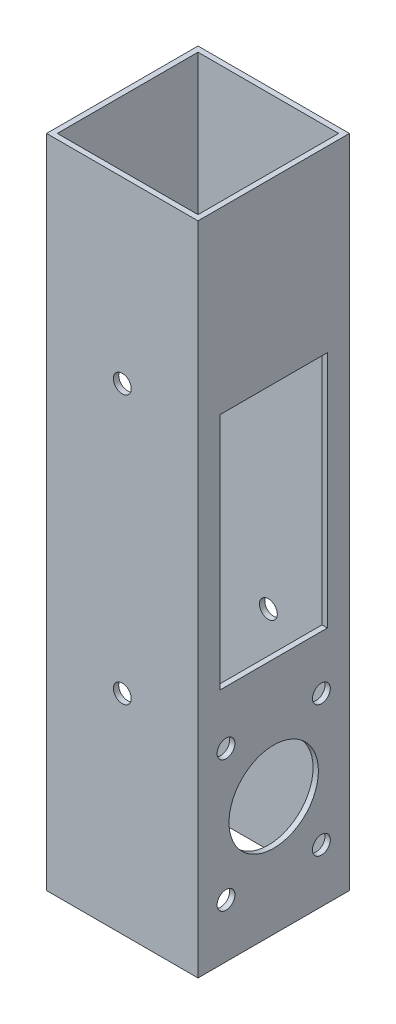
ISO-10303-21;
HEADER;
FILE_DESCRIPTION(('STEP AP214'),'2;1');
FILE_NAME('part.step','',(''),(''),'','','');
FILE_SCHEMA(('AUTOMOTIVE_DESIGN { 1 0 10303 214 1 1 1 1 }'));
ENDSEC;
DATA;
#1=APPLICATION_CONTEXT('core data for automotive mechanical design processes');
#2=APPLICATION_PROTOCOL_DEFINITION('international standard','automotive_design',2000,#1);
#3=PRODUCT_CONTEXT('',#1,'mechanical');
#4=PRODUCT('Part','Part','',(#3));
#5=PRODUCT_RELATED_PRODUCT_CATEGORY('part','',(#4));
#6=PRODUCT_DEFINITION_FORMATION('','',#4);
#7=PRODUCT_DEFINITION_CONTEXT('part definition',#1,'design');
#8=PRODUCT_DEFINITION('design','',#6,#7);
#9=PRODUCT_DEFINITION_SHAPE('','',#8);
#10=(LENGTH_UNIT() NAMED_UNIT(*) SI_UNIT(.MILLI.,.METRE.));
#11=(NAMED_UNIT(*) PLANE_ANGLE_UNIT() SI_UNIT($,.RADIAN.));
#12=(NAMED_UNIT(*) SI_UNIT($,.STERADIAN.) SOLID_ANGLE_UNIT());
#13=UNCERTAINTY_MEASURE_WITH_UNIT(LENGTH_MEASURE(1.E-05),#10,'distance_accuracy_value','');
#14=(GEOMETRIC_REPRESENTATION_CONTEXT(3) GLOBAL_UNCERTAINTY_ASSIGNED_CONTEXT((#13)) GLOBAL_UNIT_ASSIGNED_CONTEXT((#10,
#11,#12)) REPRESENTATION_CONTEXT('',''));
#15=CARTESIAN_POINT('',(0.,0.,0.));
#16=DIRECTION('',(0.,0.,1.));
#17=DIRECTION('',(1.,0.,0.));
#18=AXIS2_PLACEMENT_3D('',#15,#16,#17);
#19=CARTESIAN_POINT('',(0.,110.,0.));
#20=DIRECTION('',(0.,1.,0.));
#21=DIRECTION('',(0.,0.,1.));
#22=AXIS2_PLACEMENT_3D('',#19,#20,#21);
#23=PLANE('',#22);
#24=DIRECTION('',(0.,0.,-1.));
#25=VECTOR('',#24,1.);
#26=CARTESIAN_POINT('',(12.7,110.,-12.7));
#27=LINE('',#26,#25);
#28=CARTESIAN_POINT('',(12.7,110.,12.7));
#29=VERTEX_POINT('',#28);
#30=CARTESIAN_POINT('',(12.7,110.,-12.7));
#31=VERTEX_POINT('',#30);
#32=EDGE_CURVE('E271',#29,#31,#27,.T.);
#33=ORIENTED_EDGE('',*,*,#32,.T.);
#34=DIRECTION('',(-1.,0.,0.));
#35=VECTOR('',#34,1.);
#36=CARTESIAN_POINT('',(-12.7,110.,-12.7));
#37=LINE('',#36,#35);
#38=CARTESIAN_POINT('',(-12.7,110.,-12.7));
#39=VERTEX_POINT('',#38);
#40=EDGE_CURVE('E275',#31,#39,#37,.T.);
#41=ORIENTED_EDGE('',*,*,#40,.T.);
#42=DIRECTION('',(0.,0.,1.));
#43=VECTOR('',#42,1.);
#44=CARTESIAN_POINT('',(-12.7,110.,-12.7));
#45=LINE('',#44,#43);
#46=CARTESIAN_POINT('',(-12.7,110.,12.7));
#47=VERTEX_POINT('',#46);
#48=EDGE_CURVE('E279',#39,#47,#45,.T.);
#49=ORIENTED_EDGE('',*,*,#48,.T.);
#50=DIRECTION('',(1.,0.,0.));
#51=VECTOR('',#50,1.);
#52=CARTESIAN_POINT('',(-12.7,110.,12.7));
#53=LINE('',#52,#51);
#54=EDGE_CURVE('E282',#47,#29,#53,.T.);
#55=ORIENTED_EDGE('',*,*,#54,.T.);
#56=EDGE_LOOP('',(#33,#41,#49,#55));
#57=FACE_BOUND('',#56,.T.);
#58=DIRECTION('',(0.,0.,1.));
#59=VECTOR('',#58,1.);
#60=CARTESIAN_POINT('',(-11.8,110.,-11.8));
#61=LINE('',#60,#59);
#62=CARTESIAN_POINT('',(-11.8,110.,-11.8));
#63=VERTEX_POINT('',#62);
#64=CARTESIAN_POINT('',(-11.8,110.,11.8));
#65=VERTEX_POINT('',#64);
#66=EDGE_CURVE('E231',#63,#65,#61,.T.);
#67=ORIENTED_EDGE('',*,*,#66,.F.);
#68=DIRECTION('',(-1.,0.,0.));
#69=VECTOR('',#68,1.);
#70=CARTESIAN_POINT('',(-11.8,110.,-11.8));
#71=LINE('',#70,#69);
#72=CARTESIAN_POINT('',(11.8,110.,-11.8));
#73=VERTEX_POINT('',#72);
#74=EDGE_CURVE('E228',#73,#63,#71,.T.);
#75=ORIENTED_EDGE('',*,*,#74,.F.);
#76=DIRECTION('',(0.,0.,-1.));
#77=VECTOR('',#76,1.);
#78=CARTESIAN_POINT('',(11.8,110.,-11.8));
#79=LINE('',#78,#77);
#80=CARTESIAN_POINT('',(11.8,110.,11.8));
#81=VERTEX_POINT('',#80);
#82=EDGE_CURVE('E239',#81,#73,#79,.T.);
#83=ORIENTED_EDGE('',*,*,#82,.F.);
#84=DIRECTION('',(1.,0.,0.));
#85=VECTOR('',#84,1.);
#86=CARTESIAN_POINT('',(-11.8,110.,11.8));
#87=LINE('',#86,#85);
#88=EDGE_CURVE('E235',#65,#81,#87,.T.);
#89=ORIENTED_EDGE('',*,*,#88,.F.);
#90=EDGE_LOOP('',(#67,#75,#83,#89));
#91=FACE_BOUND('',#90,.T.);
#92=ADVANCED_FACE('F43',(#57,#91),#23,.T.);
#93=CARTESIAN_POINT('',(0.,0.,0.));
#94=DIRECTION('',(0.,1.,0.));
#95=DIRECTION('',(0.,0.,1.));
#96=AXIS2_PLACEMENT_3D('',#93,#94,#95);
#97=PLANE('',#96);
#98=DIRECTION('',(0.,0.,-1.));
#99=VECTOR('',#98,1.);
#100=CARTESIAN_POINT('',(12.7,0.,-12.7));
#101=LINE('',#100,#99);
#102=CARTESIAN_POINT('',(12.7,0.,12.7));
#103=VERTEX_POINT('',#102);
#104=CARTESIAN_POINT('',(12.7,0.,-12.7));
#105=VERTEX_POINT('',#104);
#106=EDGE_CURVE('E270',#103,#105,#101,.T.);
#107=ORIENTED_EDGE('',*,*,#106,.F.);
#108=DIRECTION('',(1.,0.,0.));
#109=VECTOR('',#108,1.);
#110=CARTESIAN_POINT('',(-12.7,0.,12.7));
#111=LINE('',#110,#109);
#112=CARTESIAN_POINT('',(-12.7,0.,12.7));
#113=VERTEX_POINT('',#112);
#114=EDGE_CURVE('E276',#113,#103,#111,.T.);
#115=ORIENTED_EDGE('',*,*,#114,.F.);
#116=DIRECTION('',(0.,0.,1.));
#117=VECTOR('',#116,1.);
#118=CARTESIAN_POINT('',(-12.7,0.,-12.7));
#119=LINE('',#118,#117);
#120=CARTESIAN_POINT('',(-12.7,0.,-12.7));
#121=VERTEX_POINT('',#120);
#122=EDGE_CURVE('E292',#121,#113,#119,.T.);
#123=ORIENTED_EDGE('',*,*,#122,.F.);
#124=DIRECTION('',(-1.,0.,0.));
#125=VECTOR('',#124,1.);
#126=CARTESIAN_POINT('',(-12.7,0.,-12.7));
#127=LINE('',#126,#125);
#128=EDGE_CURVE('E289',#105,#121,#127,.T.);
#129=ORIENTED_EDGE('',*,*,#128,.F.);
#130=EDGE_LOOP('',(#107,#115,#123,#129));
#131=FACE_BOUND('',#130,.T.);
#132=DIRECTION('',(-1.,0.,0.));
#133=VECTOR('',#132,1.);
#134=CARTESIAN_POINT('',(-11.8,0.,-11.8));
#135=LINE('',#134,#133);
#136=CARTESIAN_POINT('',(11.8,0.,-11.8));
#137=VERTEX_POINT('',#136);
#138=CARTESIAN_POINT('',(-11.8,0.,-11.8));
#139=VERTEX_POINT('',#138);
#140=EDGE_CURVE('E227',#137,#139,#135,.T.);
#141=ORIENTED_EDGE('',*,*,#140,.T.);
#142=DIRECTION('',(0.,0.,1.));
#143=VECTOR('',#142,1.);
#144=CARTESIAN_POINT('',(-11.8,0.,-11.8));
#145=LINE('',#144,#143);
#146=CARTESIAN_POINT('',(-11.8,0.,11.8));
#147=VERTEX_POINT('',#146);
#148=EDGE_CURVE('E246',#139,#147,#145,.T.);
#149=ORIENTED_EDGE('',*,*,#148,.T.);
#150=DIRECTION('',(1.,0.,0.));
#151=VECTOR('',#150,1.);
#152=CARTESIAN_POINT('',(-11.8,0.,11.8));
#153=LINE('',#152,#151);
#154=CARTESIAN_POINT('',(11.8,0.,11.8));
#155=VERTEX_POINT('',#154);
#156=EDGE_CURVE('E250',#147,#155,#153,.T.);
#157=ORIENTED_EDGE('',*,*,#156,.T.);
#158=DIRECTION('',(0.,0.,-1.));
#159=VECTOR('',#158,1.);
#160=CARTESIAN_POINT('',(11.8,0.,-11.8));
#161=LINE('',#160,#159);
#162=EDGE_CURVE('E232',#155,#137,#161,.T.);
#163=ORIENTED_EDGE('',*,*,#162,.T.);
#164=EDGE_LOOP('',(#141,#149,#157,#163));
#165=FACE_BOUND('',#164,.T.);
#166=ADVANCED_FACE('F435',(#131,#165),#97,.F.);
#167=CARTESIAN_POINT('',(12.7,110.,-12.7));
#168=DIRECTION('',(-1.,0.,0.));
#169=DIRECTION('',(0.,0.,1.));
#170=AXIS2_PLACEMENT_3D('',#167,#168,#169);
#171=PLANE('',#170);
#172=CARTESIAN_POINT('',(12.7,31.,8.));
#173=DIRECTION('',(1.,0.,0.));
#174=DIRECTION('',(0.,0.,-1.));
#175=AXIS2_PLACEMENT_3D('',#172,#173,#174);
#176=CIRCLE('',#175,1.5);
#177=CARTESIAN_POINT('',(12.7,31.,6.5));
#178=VERTEX_POINT('',#177);
#179=EDGE_CURVE('E838',#178,#178,#176,.T.);
#180=ORIENTED_EDGE('',*,*,#179,.F.);
#181=EDGE_LOOP('',(#180));
#182=FACE_BOUND('',#181,.T.);
#183=CARTESIAN_POINT('',(12.7,9.,-8.));
#184=DIRECTION('',(1.,0.,0.));
#185=DIRECTION('',(0.,0.,-1.));
#186=AXIS2_PLACEMENT_3D('',#183,#184,#185);
#187=CIRCLE('',#186,1.5);
#188=CARTESIAN_POINT('',(12.7,9.,-9.5));
#189=VERTEX_POINT('',#188);
#190=EDGE_CURVE('E862',#189,#189,#187,.T.);
#191=ORIENTED_EDGE('',*,*,#190,.F.);
#192=EDGE_LOOP('',(#191));
#193=FACE_BOUND('',#192,.T.);
#194=CARTESIAN_POINT('',(12.7,9.,8.));
#195=DIRECTION('',(1.,0.,0.));
#196=DIRECTION('',(0.,0.,1.));
#197=AXIS2_PLACEMENT_3D('',#194,#195,#196);
#198=CIRCLE('',#197,1.5);
#199=CARTESIAN_POINT('',(12.7,9.,9.5));
#200=VERTEX_POINT('',#199);
#201=EDGE_CURVE('E851',#200,#200,#198,.T.);
#202=ORIENTED_EDGE('',*,*,#201,.F.);
#203=EDGE_LOOP('',(#202));
#204=FACE_BOUND('',#203,.T.);
#205=CARTESIAN_POINT('',(12.7,31.,-8.));
#206=DIRECTION('',(1.,0.,0.));
#207=DIRECTION('',(0.,0.,1.));
#208=AXIS2_PLACEMENT_3D('',#205,#206,#207);
#209=CIRCLE('',#208,1.5);
#210=CARTESIAN_POINT('',(12.7,31.,-6.5));
#211=VERTEX_POINT('',#210);
#212=EDGE_CURVE('E848',#211,#211,#209,.T.);
#213=ORIENTED_EDGE('',*,*,#212,.F.);
#214=EDGE_LOOP('',(#213));
#215=FACE_BOUND('',#214,.T.);
#216=CARTESIAN_POINT('',(12.7,20.,0.));
#217=DIRECTION('',(1.,0.,0.));
#218=DIRECTION('',(0.,0.,-1.));
#219=AXIS2_PLACEMENT_3D('',#216,#217,#218);
#220=CIRCLE('',#219,7.5);
#221=CARTESIAN_POINT('',(12.7,20.,-7.5));
#222=VERTEX_POINT('',#221);
#223=EDGE_CURVE('E185',#222,#222,#220,.T.);
#224=ORIENTED_EDGE('',*,*,#223,.F.);
#225=EDGE_LOOP('',(#224));
#226=FACE_BOUND('',#225,.T.);
#227=DIRECTION('',(0.,0.,1.));
#228=VECTOR('',#227,1.);
#229=CARTESIAN_POINT('',(12.7,80.,9.));
#230=LINE('',#229,#228);
#231=CARTESIAN_POINT('',(12.7,80.,-9.));
#232=VERTEX_POINT('',#231);
#233=CARTESIAN_POINT('',(12.7,80.,9.));
#234=VERTEX_POINT('',#233);
#235=EDGE_CURVE('E183',#232,#234,#230,.T.);
#236=ORIENTED_EDGE('',*,*,#235,.F.);
#237=DIRECTION('',(0.,1.,0.));
#238=VECTOR('',#237,1.);
#239=CARTESIAN_POINT('',(12.7,40.,-9.));
#240=LINE('',#239,#238);
#241=CARTESIAN_POINT('',(12.7,40.,-9.));
#242=VERTEX_POINT('',#241);
#243=EDGE_CURVE('E61',#242,#232,#240,.T.);
#244=ORIENTED_EDGE('',*,*,#243,.F.);
#245=DIRECTION('',(0.,0.,-1.));
#246=VECTOR('',#245,1.);
#247=CARTESIAN_POINT('',(12.7,40.,9.));
#248=LINE('',#247,#246);
#249=CARTESIAN_POINT('',(12.7,40.,9.));
#250=VERTEX_POINT('',#249);
#251=EDGE_CURVE('E169',#250,#242,#248,.T.);
#252=ORIENTED_EDGE('',*,*,#251,.F.);
#253=DIRECTION('',(0.,-1.,0.));
#254=VECTOR('',#253,1.);
#255=CARTESIAN_POINT('',(12.7,40.,9.));
#256=LINE('',#255,#254);
#257=EDGE_CURVE('E177',#234,#250,#256,.T.);
#258=ORIENTED_EDGE('',*,*,#257,.F.);
#259=EDGE_LOOP('',(#236,#244,#252,#258));
#260=FACE_BOUND('',#259,.T.);
#261=ORIENTED_EDGE('',*,*,#106,.T.);
#262=DIRECTION('',(0.,-1.,0.));
#263=VECTOR('',#262,1.);
#264=CARTESIAN_POINT('',(12.7,110.,-12.7));
#265=LINE('',#264,#263);
#266=EDGE_CURVE('E308',#31,#105,#265,.T.);
#267=ORIENTED_EDGE('',*,*,#266,.F.);
#268=ORIENTED_EDGE('',*,*,#32,.F.);
#269=DIRECTION('',(0.,-1.,0.));
#270=VECTOR('',#269,1.);
#271=CARTESIAN_POINT('',(12.7,110.,12.7));
#272=LINE('',#271,#270);
#273=EDGE_CURVE('E285',#29,#103,#272,.T.);
#274=ORIENTED_EDGE('',*,*,#273,.T.);
#275=EDGE_LOOP('',(#261,#267,#268,#274));
#276=FACE_BOUND('',#275,.T.);
#277=ADVANCED_FACE('F45',(#182,#193,#204,#215,#226,#260,#276),#171,.F.);
#278=CARTESIAN_POINT('',(-12.7,110.,-12.7));
#279=DIRECTION('',(0.,0.,1.));
#280=DIRECTION('',(1.,0.,0.));
#281=AXIS2_PLACEMENT_3D('',#278,#279,#280);
#282=PLANE('',#281);
#283=CARTESIAN_POINT('',(0.,35.,-12.7));
#284=DIRECTION('',(0.,0.,-1.));
#285=DIRECTION('',(-1.,0.,0.));
#286=AXIS2_PLACEMENT_3D('',#283,#284,#285);
#287=CIRCLE('',#286,1.5);
#288=CARTESIAN_POINT('',(-1.5,35.,-12.7));
#289=VERTEX_POINT('',#288);
#290=EDGE_CURVE('E369',#289,#289,#287,.T.);
#291=ORIENTED_EDGE('',*,*,#290,.F.);
#292=EDGE_LOOP('',(#291));
#293=FACE_BOUND('',#292,.T.);
#294=CARTESIAN_POINT('',(0.,80.,-12.7));
#295=DIRECTION('',(0.,0.,-1.));
#296=DIRECTION('',(-1.,0.,0.));
#297=AXIS2_PLACEMENT_3D('',#294,#295,#296);
#298=CIRCLE('',#297,1.5);
#299=CARTESIAN_POINT('',(-1.5,80.,-12.7));
#300=VERTEX_POINT('',#299);
#301=EDGE_CURVE('E373',#300,#300,#298,.T.);
#302=ORIENTED_EDGE('',*,*,#301,.F.);
#303=EDGE_LOOP('',(#302));
#304=FACE_BOUND('',#303,.T.);
#305=ORIENTED_EDGE('',*,*,#128,.T.);
#306=DIRECTION('',(0.,-1.,0.));
#307=VECTOR('',#306,1.);
#308=CARTESIAN_POINT('',(-12.7,110.,-12.7));
#309=LINE('',#308,#307);
#310=EDGE_CURVE('E304',#39,#121,#309,.T.);
#311=ORIENTED_EDGE('',*,*,#310,.F.);
#312=ORIENTED_EDGE('',*,*,#40,.F.);
#313=ORIENTED_EDGE('',*,*,#266,.T.);
#314=EDGE_LOOP('',(#305,#311,#312,#313));
#315=FACE_BOUND('',#314,.T.);
#316=ADVANCED_FACE('F476',(#293,#304,#315),#282,.F.);
#317=CARTESIAN_POINT('',(-12.7,110.,-12.7));
#318=DIRECTION('',(1.,0.,0.));
#319=DIRECTION('',(0.,0.,-1.));
#320=AXIS2_PLACEMENT_3D('',#317,#318,#319);
#321=PLANE('',#320);
#322=CARTESIAN_POINT('',(-12.7,31.,8.));
#323=DIRECTION('',(1.,0.,0.));
#324=DIRECTION('',(0.,0.,-1.));
#325=AXIS2_PLACEMENT_3D('',#322,#323,#324);
#326=CIRCLE('',#325,1.5);
#327=CARTESIAN_POINT('',(-12.7,31.,6.5));
#328=VERTEX_POINT('',#327);
#329=EDGE_CURVE('E836',#328,#328,#326,.T.);
#330=ORIENTED_EDGE('',*,*,#329,.T.);
#331=EDGE_LOOP('',(#330));
#332=FACE_BOUND('',#331,.T.);
#333=CARTESIAN_POINT('',(-12.7,9.,-8.));
#334=DIRECTION('',(1.,0.,0.));
#335=DIRECTION('',(0.,0.,-1.));
#336=AXIS2_PLACEMENT_3D('',#333,#334,#335);
#337=CIRCLE('',#336,1.5);
#338=CARTESIAN_POINT('',(-12.7,9.,-9.5));
#339=VERTEX_POINT('',#338);
#340=EDGE_CURVE('E842',#339,#339,#337,.T.);
#341=ORIENTED_EDGE('',*,*,#340,.T.);
#342=EDGE_LOOP('',(#341));
#343=FACE_BOUND('',#342,.T.);
#344=CARTESIAN_POINT('',(-12.7,9.,8.));
#345=DIRECTION('',(1.,0.,0.));
#346=DIRECTION('',(0.,0.,1.));
#347=AXIS2_PLACEMENT_3D('',#344,#345,#346);
#348=CIRCLE('',#347,1.5);
#349=CARTESIAN_POINT('',(-12.7,9.,9.5));
#350=VERTEX_POINT('',#349);
#351=EDGE_CURVE('E856',#350,#350,#348,.T.);
#352=ORIENTED_EDGE('',*,*,#351,.T.);
#353=EDGE_LOOP('',(#352));
#354=FACE_BOUND('',#353,.T.);
#355=CARTESIAN_POINT('',(-12.7,31.,-8.));
#356=DIRECTION('',(1.,0.,0.));
#357=DIRECTION('',(0.,0.,1.));
#358=AXIS2_PLACEMENT_3D('',#355,#356,#357);
#359=CIRCLE('',#358,1.5);
#360=CARTESIAN_POINT('',(-12.7,31.,-6.5));
#361=VERTEX_POINT('',#360);
#362=EDGE_CURVE('E339',#361,#361,#359,.T.);
#363=ORIENTED_EDGE('',*,*,#362,.T.);
#364=EDGE_LOOP('',(#363));
#365=FACE_BOUND('',#364,.T.);
#366=CARTESIAN_POINT('',(-12.7,20.,0.));
#367=DIRECTION('',(1.,0.,0.));
#368=DIRECTION('',(0.,0.,-1.));
#369=AXIS2_PLACEMENT_3D('',#366,#367,#368);
#370=CIRCLE('',#369,7.5);
#371=CARTESIAN_POINT('',(-12.7,20.,-7.5));
#372=VERTEX_POINT('',#371);
#373=EDGE_CURVE('E190',#372,#372,#370,.T.);
#374=ORIENTED_EDGE('',*,*,#373,.T.);
#375=EDGE_LOOP('',(#374));
#376=FACE_BOUND('',#375,.T.);
#377=DIRECTION('',(0.,0.,-1.));
#378=VECTOR('',#377,1.);
#379=CARTESIAN_POINT('',(-12.7,40.,9.));
#380=LINE('',#379,#378);
#381=CARTESIAN_POINT('',(-12.7,40.,9.));
#382=VERTEX_POINT('',#381);
#383=CARTESIAN_POINT('',(-12.7,40.,-9.));
#384=VERTEX_POINT('',#383);
#385=EDGE_CURVE('E195',#382,#384,#380,.T.);
#386=ORIENTED_EDGE('',*,*,#385,.T.);
#387=DIRECTION('',(0.,1.,0.));
#388=VECTOR('',#387,1.);
#389=CARTESIAN_POINT('',(-12.7,40.,-9.));
#390=LINE('',#389,#388);
#391=CARTESIAN_POINT('',(-12.7,80.,-9.));
#392=VERTEX_POINT('',#391);
#393=EDGE_CURVE('E178',#384,#392,#390,.T.);
#394=ORIENTED_EDGE('',*,*,#393,.T.);
#395=DIRECTION('',(0.,0.,1.));
#396=VECTOR('',#395,1.);
#397=CARTESIAN_POINT('',(-12.7,80.,9.));
#398=LINE('',#397,#396);
#399=CARTESIAN_POINT('',(-12.7,80.,9.));
#400=VERTEX_POINT('',#399);
#401=EDGE_CURVE('E202',#392,#400,#398,.T.);
#402=ORIENTED_EDGE('',*,*,#401,.T.);
#403=DIRECTION('',(0.,-1.,0.));
#404=VECTOR('',#403,1.);
#405=CARTESIAN_POINT('',(-12.7,40.,9.));
#406=LINE('',#405,#404);
#407=EDGE_CURVE('E69',#400,#382,#406,.T.);
#408=ORIENTED_EDGE('',*,*,#407,.T.);
#409=EDGE_LOOP('',(#386,#394,#402,#408));
#410=FACE_BOUND('',#409,.T.);
#411=ORIENTED_EDGE('',*,*,#122,.T.);
#412=DIRECTION('',(0.,-1.,0.));
#413=VECTOR('',#412,1.);
#414=CARTESIAN_POINT('',(-12.7,110.,12.7));
#415=LINE('',#414,#413);
#416=EDGE_CURVE('E300',#47,#113,#415,.T.);
#417=ORIENTED_EDGE('',*,*,#416,.F.);
#418=ORIENTED_EDGE('',*,*,#48,.F.);
#419=ORIENTED_EDGE('',*,*,#310,.T.);
#420=EDGE_LOOP('',(#411,#417,#418,#419));
#421=FACE_BOUND('',#420,.T.);
#422=ADVANCED_FACE('F473',(#332,#343,#354,#365,#376,#410,#421),#321,.F.);
#423=CARTESIAN_POINT('',(-12.7,110.,12.7));
#424=DIRECTION('',(0.,0.,-1.));
#425=DIRECTION('',(-1.,0.,0.));
#426=AXIS2_PLACEMENT_3D('',#423,#424,#425);
#427=PLANE('',#426);
#428=CARTESIAN_POINT('',(0.,35.,12.7));
#429=DIRECTION('',(0.,0.,-1.));
#430=DIRECTION('',(-1.,0.,0.));
#431=AXIS2_PLACEMENT_3D('',#428,#429,#430);
#432=CIRCLE('',#431,1.5);
#433=CARTESIAN_POINT('',(-1.5,35.,12.7));
#434=VERTEX_POINT('',#433);
#435=EDGE_CURVE('E329',#434,#434,#432,.T.);
#436=ORIENTED_EDGE('',*,*,#435,.T.);
#437=EDGE_LOOP('',(#436));
#438=FACE_BOUND('',#437,.T.);
#439=CARTESIAN_POINT('',(0.,80.,12.7));
#440=DIRECTION('',(0.,0.,-1.));
#441=DIRECTION('',(-1.,0.,0.));
#442=AXIS2_PLACEMENT_3D('',#439,#440,#441);
#443=CIRCLE('',#442,1.5);
#444=CARTESIAN_POINT('',(-1.5,80.,12.7));
#445=VERTEX_POINT('',#444);
#446=EDGE_CURVE('E365',#445,#445,#443,.T.);
#447=ORIENTED_EDGE('',*,*,#446,.T.);
#448=EDGE_LOOP('',(#447));
#449=FACE_BOUND('',#448,.T.);
#450=ORIENTED_EDGE('',*,*,#114,.T.);
#451=ORIENTED_EDGE('',*,*,#273,.F.);
#452=ORIENTED_EDGE('',*,*,#54,.F.);
#453=ORIENTED_EDGE('',*,*,#416,.T.);
#454=EDGE_LOOP('',(#450,#451,#452,#453));
#455=FACE_BOUND('',#454,.T.);
#456=ADVANCED_FACE('F457',(#438,#449,#455),#427,.F.);
#457=CARTESIAN_POINT('',(-11.8,110.,-11.8));
#458=DIRECTION('',(0.,0.,1.));
#459=DIRECTION('',(1.,0.,0.));
#460=AXIS2_PLACEMENT_3D('',#457,#458,#459);
#461=PLANE('',#460);
#462=CARTESIAN_POINT('',(0.,35.,-11.8));
#463=DIRECTION('',(0.,0.,1.));
#464=DIRECTION('',(1.,0.,0.));
#465=AXIS2_PLACEMENT_3D('',#462,#463,#464);
#466=CIRCLE('',#465,1.5);
#467=CARTESIAN_POINT('',(1.5,35.,-11.8));
#468=VERTEX_POINT('',#467);
#469=EDGE_CURVE('E166',#468,#468,#466,.T.);
#470=ORIENTED_EDGE('',*,*,#469,.F.);
#471=EDGE_LOOP('',(#470));
#472=FACE_BOUND('',#471,.T.);
#473=CARTESIAN_POINT('',(0.,80.,-11.8));
#474=DIRECTION('',(0.,0.,1.));
#475=DIRECTION('',(1.,0.,0.));
#476=AXIS2_PLACEMENT_3D('',#473,#474,#475);
#477=CIRCLE('',#476,1.5);
#478=CARTESIAN_POINT('',(1.5,80.,-11.8));
#479=VERTEX_POINT('',#478);
#480=EDGE_CURVE('E328',#479,#479,#477,.T.);
#481=ORIENTED_EDGE('',*,*,#480,.F.);
#482=EDGE_LOOP('',(#481));
#483=FACE_BOUND('',#482,.T.);
#484=ORIENTED_EDGE('',*,*,#140,.F.);
#485=DIRECTION('',(0.,-1.,0.));
#486=VECTOR('',#485,1.);
#487=CARTESIAN_POINT('',(11.8,110.,-11.8));
#488=LINE('',#487,#486);
#489=EDGE_CURVE('E242',#73,#137,#488,.T.);
#490=ORIENTED_EDGE('',*,*,#489,.F.);
#491=ORIENTED_EDGE('',*,*,#74,.T.);
#492=DIRECTION('',(0.,-1.,0.));
#493=VECTOR('',#492,1.);
#494=CARTESIAN_POINT('',(-11.8,110.,-11.8));
#495=LINE('',#494,#493);
#496=EDGE_CURVE('E266',#63,#139,#495,.T.);
#497=ORIENTED_EDGE('',*,*,#496,.T.);
#498=EDGE_LOOP('',(#484,#490,#491,#497));
#499=FACE_BOUND('',#498,.T.);
#500=ADVANCED_FACE('F444',(#472,#483,#499),#461,.T.);
#501=CARTESIAN_POINT('',(-11.8,110.,-11.8));
#502=DIRECTION('',(1.,0.,0.));
#503=DIRECTION('',(0.,0.,-1.));
#504=AXIS2_PLACEMENT_3D('',#501,#502,#503);
#505=PLANE('',#504);
#506=CARTESIAN_POINT('',(-11.8,31.,8.));
#507=DIRECTION('',(1.,0.,0.));
#508=DIRECTION('',(0.,0.,-1.));
#509=AXIS2_PLACEMENT_3D('',#506,#507,#508);
#510=CIRCLE('',#509,1.5);
#511=CARTESIAN_POINT('',(-11.8,31.,6.5));
#512=VERTEX_POINT('',#511);
#513=EDGE_CURVE('E361',#512,#512,#510,.T.);
#514=ORIENTED_EDGE('',*,*,#513,.F.);
#515=EDGE_LOOP('',(#514));
#516=FACE_BOUND('',#515,.T.);
#517=CARTESIAN_POINT('',(-11.8,9.,-8.));
#518=DIRECTION('',(1.,0.,0.));
#519=DIRECTION('',(0.,0.,-1.));
#520=AXIS2_PLACEMENT_3D('',#517,#518,#519);
#521=CIRCLE('',#520,1.5);
#522=CARTESIAN_POINT('',(-11.8,9.,-9.5));
#523=VERTEX_POINT('',#522);
#524=EDGE_CURVE('E347',#523,#523,#521,.T.);
#525=ORIENTED_EDGE('',*,*,#524,.F.);
#526=EDGE_LOOP('',(#525));
#527=FACE_BOUND('',#526,.T.);
#528=CARTESIAN_POINT('',(-11.8,9.,8.));
#529=DIRECTION('',(1.,0.,0.));
#530=DIRECTION('',(0.,0.,-1.));
#531=AXIS2_PLACEMENT_3D('',#528,#529,#530);
#532=CIRCLE('',#531,1.5);
#533=CARTESIAN_POINT('',(-11.8,9.,6.5));
#534=VERTEX_POINT('',#533);
#535=EDGE_CURVE('E343',#534,#534,#532,.T.);
#536=ORIENTED_EDGE('',*,*,#535,.F.);
#537=EDGE_LOOP('',(#536));
#538=FACE_BOUND('',#537,.T.);
#539=CARTESIAN_POINT('',(-11.8,31.,-8.));
#540=DIRECTION('',(1.,0.,0.));
#541=DIRECTION('',(0.,0.,-1.));
#542=AXIS2_PLACEMENT_3D('',#539,#540,#541);
#543=CIRCLE('',#542,1.5);
#544=CARTESIAN_POINT('',(-11.8,31.,-9.5));
#545=VERTEX_POINT('',#544);
#546=EDGE_CURVE('E338',#545,#545,#543,.T.);
#547=ORIENTED_EDGE('',*,*,#546,.F.);
#548=EDGE_LOOP('',(#547));
#549=FACE_BOUND('',#548,.T.);
#550=CARTESIAN_POINT('',(-11.8,20.,0.));
#551=DIRECTION('',(1.,0.,0.));
#552=DIRECTION('',(0.,0.,-1.));
#553=AXIS2_PLACEMENT_3D('',#550,#551,#552);
#554=CIRCLE('',#553,7.5);
#555=CARTESIAN_POINT('',(-11.8,20.,-7.5));
#556=VERTEX_POINT('',#555);
#557=EDGE_CURVE('E223',#556,#556,#554,.T.);
#558=ORIENTED_EDGE('',*,*,#557,.F.);
#559=EDGE_LOOP('',(#558));
#560=FACE_BOUND('',#559,.T.);
#561=DIRECTION('',(0.,1.,0.));
#562=VECTOR('',#561,1.);
#563=CARTESIAN_POINT('',(-11.8,110.,-9.));
#564=LINE('',#563,#562);
#565=CARTESIAN_POINT('',(-11.8,40.,-9.));
#566=VERTEX_POINT('',#565);
#567=CARTESIAN_POINT('',(-11.8,80.,-9.));
#568=VERTEX_POINT('',#567);
#569=EDGE_CURVE('E218',#566,#568,#564,.T.);
#570=ORIENTED_EDGE('',*,*,#569,.F.);
#571=DIRECTION('',(0.,0.,-1.));
#572=VECTOR('',#571,1.);
#573=CARTESIAN_POINT('',(-11.8,40.,-11.8));
#574=LINE('',#573,#572);
#575=CARTESIAN_POINT('',(-11.8,40.,9.));
#576=VERTEX_POINT('',#575);
#577=EDGE_CURVE('E215',#576,#566,#574,.T.);
#578=ORIENTED_EDGE('',*,*,#577,.F.);
#579=DIRECTION('',(0.,-1.,0.));
#580=VECTOR('',#579,1.);
#581=CARTESIAN_POINT('',(-11.8,110.,9.));
#582=LINE('',#581,#580);
#583=CARTESIAN_POINT('',(-11.8,80.,9.));
#584=VERTEX_POINT('',#583);
#585=EDGE_CURVE('E212',#584,#576,#582,.T.);
#586=ORIENTED_EDGE('',*,*,#585,.F.);
#587=DIRECTION('',(0.,0.,1.));
#588=VECTOR('',#587,1.);
#589=CARTESIAN_POINT('',(-11.8,80.,-11.8));
#590=LINE('',#589,#588);
#591=EDGE_CURVE('E209',#568,#584,#590,.T.);
#592=ORIENTED_EDGE('',*,*,#591,.F.);
#593=EDGE_LOOP('',(#570,#578,#586,#592));
#594=FACE_BOUND('',#593,.T.);
#595=ORIENTED_EDGE('',*,*,#148,.F.);
#596=ORIENTED_EDGE('',*,*,#496,.F.);
#597=ORIENTED_EDGE('',*,*,#66,.T.);
#598=DIRECTION('',(0.,-1.,0.));
#599=VECTOR('',#598,1.);
#600=CARTESIAN_POINT('',(-11.8,110.,11.8));
#601=LINE('',#600,#599);
#602=EDGE_CURVE('E263',#65,#147,#601,.T.);
#603=ORIENTED_EDGE('',*,*,#602,.T.);
#604=EDGE_LOOP('',(#595,#596,#597,#603));
#605=FACE_BOUND('',#604,.T.);
#606=ADVANCED_FACE('F447',(#516,#527,#538,#549,#560,#594,#605),#505,.T.);
#607=CARTESIAN_POINT('',(-11.8,110.,11.8));
#608=DIRECTION('',(0.,0.,-1.));
#609=DIRECTION('',(-1.,0.,0.));
#610=AXIS2_PLACEMENT_3D('',#607,#608,#609);
#611=PLANE('',#610);
#612=CARTESIAN_POINT('',(0.,35.,11.8));
#613=DIRECTION('',(0.,0.,-1.));
#614=DIRECTION('',(-1.,0.,0.));
#615=AXIS2_PLACEMENT_3D('',#612,#613,#614);
#616=CIRCLE('',#615,1.5);
#617=CARTESIAN_POINT('',(-1.5,35.,11.8));
#618=VERTEX_POINT('',#617);
#619=EDGE_CURVE('E330',#618,#618,#616,.T.);
#620=ORIENTED_EDGE('',*,*,#619,.F.);
#621=EDGE_LOOP('',(#620));
#622=FACE_BOUND('',#621,.T.);
#623=CARTESIAN_POINT('',(0.,80.,11.8));
#624=DIRECTION('',(0.,0.,-1.));
#625=DIRECTION('',(-1.,0.,0.));
#626=AXIS2_PLACEMENT_3D('',#623,#624,#625);
#627=CIRCLE('',#626,1.5);
#628=CARTESIAN_POINT('',(-1.5,80.,11.8));
#629=VERTEX_POINT('',#628);
#630=EDGE_CURVE('E324',#629,#629,#627,.T.);
#631=ORIENTED_EDGE('',*,*,#630,.F.);
#632=EDGE_LOOP('',(#631));
#633=FACE_BOUND('',#632,.T.);
#634=ORIENTED_EDGE('',*,*,#156,.F.);
#635=ORIENTED_EDGE('',*,*,#602,.F.);
#636=ORIENTED_EDGE('',*,*,#88,.T.);
#637=DIRECTION('',(0.,-1.,0.));
#638=VECTOR('',#637,1.);
#639=CARTESIAN_POINT('',(11.8,110.,11.8));
#640=LINE('',#639,#638);
#641=EDGE_CURVE('E260',#81,#155,#640,.T.);
#642=ORIENTED_EDGE('',*,*,#641,.T.);
#643=EDGE_LOOP('',(#634,#635,#636,#642));
#644=FACE_BOUND('',#643,.T.);
#645=ADVANCED_FACE('F421',(#622,#633,#644),#611,.T.);
#646=CARTESIAN_POINT('',(11.8,110.,-11.8));
#647=DIRECTION('',(-1.,0.,0.));
#648=DIRECTION('',(0.,0.,1.));
#649=AXIS2_PLACEMENT_3D('',#646,#647,#648);
#650=PLANE('',#649);
#651=CARTESIAN_POINT('',(11.8,31.,8.));
#652=DIRECTION('',(-1.,0.,0.));
#653=DIRECTION('',(0.,0.,1.));
#654=AXIS2_PLACEMENT_3D('',#651,#652,#653);
#655=CIRCLE('',#654,1.5);
#656=CARTESIAN_POINT('',(11.8,31.,9.5));
#657=VERTEX_POINT('',#656);
#658=EDGE_CURVE('E47',#657,#657,#655,.T.);
#659=ORIENTED_EDGE('',*,*,#658,.F.);
#660=EDGE_LOOP('',(#659));
#661=FACE_BOUND('',#660,.T.);
#662=CARTESIAN_POINT('',(11.8,9.,-8.));
#663=DIRECTION('',(-1.,0.,0.));
#664=DIRECTION('',(0.,0.,1.));
#665=AXIS2_PLACEMENT_3D('',#662,#663,#664);
#666=CIRCLE('',#665,1.5);
#667=CARTESIAN_POINT('',(11.8,9.,-6.5));
#668=VERTEX_POINT('',#667);
#669=EDGE_CURVE('E344',#668,#668,#666,.T.);
#670=ORIENTED_EDGE('',*,*,#669,.F.);
#671=EDGE_LOOP('',(#670));
#672=FACE_BOUND('',#671,.T.);
#673=CARTESIAN_POINT('',(11.8,9.,8.));
#674=DIRECTION('',(-1.,0.,0.));
#675=DIRECTION('',(0.,0.,1.));
#676=AXIS2_PLACEMENT_3D('',#673,#674,#675);
#677=CIRCLE('',#676,1.5);
#678=CARTESIAN_POINT('',(11.8,9.,9.5));
#679=VERTEX_POINT('',#678);
#680=EDGE_CURVE('E340',#679,#679,#677,.T.);
#681=ORIENTED_EDGE('',*,*,#680,.F.);
#682=EDGE_LOOP('',(#681));
#683=FACE_BOUND('',#682,.T.);
#684=CARTESIAN_POINT('',(11.8,31.,-8.));
#685=DIRECTION('',(-1.,0.,0.));
#686=DIRECTION('',(0.,0.,1.));
#687=AXIS2_PLACEMENT_3D('',#684,#685,#686);
#688=CIRCLE('',#687,1.5);
#689=CARTESIAN_POINT('',(11.8,31.,-6.5));
#690=VERTEX_POINT('',#689);
#691=EDGE_CURVE('E334',#690,#690,#688,.T.);
#692=ORIENTED_EDGE('',*,*,#691,.F.);
#693=EDGE_LOOP('',(#692));
#694=FACE_BOUND('',#693,.T.);
#695=CARTESIAN_POINT('',(11.8,20.,0.));
#696=DIRECTION('',(-1.,0.,0.));
#697=DIRECTION('',(0.,0.,1.));
#698=AXIS2_PLACEMENT_3D('',#695,#696,#697);
#699=CIRCLE('',#698,7.5);
#700=CARTESIAN_POINT('',(11.8,20.,7.5));
#701=VERTEX_POINT('',#700);
#702=EDGE_CURVE('E222',#701,#701,#699,.T.);
#703=ORIENTED_EDGE('',*,*,#702,.F.);
#704=EDGE_LOOP('',(#703));
#705=FACE_BOUND('',#704,.T.);
#706=DIRECTION('',(0.,-1.,0.));
#707=VECTOR('',#706,1.);
#708=CARTESIAN_POINT('',(11.8,110.,-9.));
#709=LINE('',#708,#707);
#710=CARTESIAN_POINT('',(11.8,80.,-9.));
#711=VERTEX_POINT('',#710);
#712=CARTESIAN_POINT('',(11.8,40.,-9.));
#713=VERTEX_POINT('',#712);
#714=EDGE_CURVE('E11',#711,#713,#709,.T.);
#715=ORIENTED_EDGE('',*,*,#714,.F.);
#716=DIRECTION('',(0.,0.,-1.));
#717=VECTOR('',#716,1.);
#718=CARTESIAN_POINT('',(11.8,80.,-11.8));
#719=LINE('',#718,#717);
#720=CARTESIAN_POINT('',(11.8,80.,9.));
#721=VERTEX_POINT('',#720);
#722=EDGE_CURVE('E312',#721,#711,#719,.T.);
#723=ORIENTED_EDGE('',*,*,#722,.F.);
#724=DIRECTION('',(0.,1.,0.));
#725=VECTOR('',#724,1.);
#726=CARTESIAN_POINT('',(11.8,110.,9.));
#727=LINE('',#726,#725);
#728=CARTESIAN_POINT('',(11.8,40.,9.));
#729=VERTEX_POINT('',#728);
#730=EDGE_CURVE('E315',#729,#721,#727,.T.);
#731=ORIENTED_EDGE('',*,*,#730,.F.);
#732=DIRECTION('',(0.,0.,1.));
#733=VECTOR('',#732,1.);
#734=CARTESIAN_POINT('',(11.8,40.,-11.8));
#735=LINE('',#734,#733);
#736=EDGE_CURVE('E53',#713,#729,#735,.T.);
#737=ORIENTED_EDGE('',*,*,#736,.F.);
#738=EDGE_LOOP('',(#715,#723,#731,#737));
#739=FACE_BOUND('',#738,.T.);
#740=ORIENTED_EDGE('',*,*,#162,.F.);
#741=ORIENTED_EDGE('',*,*,#641,.F.);
#742=ORIENTED_EDGE('',*,*,#82,.T.);
#743=ORIENTED_EDGE('',*,*,#489,.T.);
#744=EDGE_LOOP('',(#740,#741,#742,#743));
#745=FACE_BOUND('',#744,.T.);
#746=ADVANCED_FACE('F418',(#661,#672,#683,#694,#705,#739,#745),#650,.T.);
#747=CARTESIAN_POINT('',(-12.7,80.,9.));
#748=DIRECTION('',(0.,1.,0.));
#749=DIRECTION('',(0.,0.,1.));
#750=AXIS2_PLACEMENT_3D('',#747,#748,#749);
#751=PLANE('',#750);
#752=ORIENTED_EDGE('',*,*,#722,.T.);
#753=DIRECTION('',(1.,0.,0.));
#754=VECTOR('',#753,1.);
#755=CARTESIAN_POINT('',(-12.7,80.,-9.));
#756=LINE('',#755,#754);
#757=EDGE_CURVE('E391',#711,#232,#756,.T.);
#758=ORIENTED_EDGE('',*,*,#757,.T.);
#759=ORIENTED_EDGE('',*,*,#235,.T.);
#760=DIRECTION('',(1.,0.,0.));
#761=VECTOR('',#760,1.);
#762=CARTESIAN_POINT('',(-12.7,80.,9.));
#763=LINE('',#762,#761);
#764=EDGE_CURVE('E395',#721,#234,#763,.T.);
#765=ORIENTED_EDGE('',*,*,#764,.F.);
#766=EDGE_LOOP('',(#752,#758,#759,#765));
#767=FACE_BOUND('',#766,.T.);
#768=ADVANCED_FACE('F408',(#767),#751,.F.);
#769=CARTESIAN_POINT('',(-12.7,40.,9.));
#770=DIRECTION('',(0.,0.,1.));
#771=DIRECTION('',(1.,0.,0.));
#772=AXIS2_PLACEMENT_3D('',#769,#770,#771);
#773=PLANE('',#772);
#774=ORIENTED_EDGE('',*,*,#730,.T.);
#775=ORIENTED_EDGE('',*,*,#764,.T.);
#776=ORIENTED_EDGE('',*,*,#257,.T.);
#777=DIRECTION('',(1.,0.,0.));
#778=VECTOR('',#777,1.);
#779=CARTESIAN_POINT('',(-12.7,40.,9.));
#780=LINE('',#779,#778);
#781=EDGE_CURVE('E172',#729,#250,#780,.T.);
#782=ORIENTED_EDGE('',*,*,#781,.F.);
#783=EDGE_LOOP('',(#774,#775,#776,#782));
#784=FACE_BOUND('',#783,.T.);
#785=ADVANCED_FACE('F403',(#784),#773,.F.);
#786=CARTESIAN_POINT('',(-12.7,40.,9.));
#787=DIRECTION('',(0.,-1.,0.));
#788=DIRECTION('',(0.,0.,-1.));
#789=AXIS2_PLACEMENT_3D('',#786,#787,#788);
#790=PLANE('',#789);
#791=ORIENTED_EDGE('',*,*,#736,.T.);
#792=ORIENTED_EDGE('',*,*,#781,.T.);
#793=ORIENTED_EDGE('',*,*,#251,.T.);
#794=DIRECTION('',(1.,0.,0.));
#795=VECTOR('',#794,1.);
#796=CARTESIAN_POINT('',(-12.7,40.,-9.));
#797=LINE('',#796,#795);
#798=EDGE_CURVE('E158',#713,#242,#797,.T.);
#799=ORIENTED_EDGE('',*,*,#798,.F.);
#800=EDGE_LOOP('',(#791,#792,#793,#799));
#801=FACE_BOUND('',#800,.T.);
#802=ADVANCED_FACE('F170',(#801),#790,.F.);
#803=CARTESIAN_POINT('',(-12.7,40.,-9.));
#804=DIRECTION('',(0.,0.,-1.));
#805=DIRECTION('',(-1.,0.,0.));
#806=AXIS2_PLACEMENT_3D('',#803,#804,#805);
#807=PLANE('',#806);
#808=ORIENTED_EDGE('',*,*,#714,.T.);
#809=ORIENTED_EDGE('',*,*,#798,.T.);
#810=ORIENTED_EDGE('',*,*,#243,.T.);
#811=ORIENTED_EDGE('',*,*,#757,.F.);
#812=EDGE_LOOP('',(#808,#809,#810,#811));
#813=FACE_BOUND('',#812,.T.);
#814=ADVANCED_FACE('F160',(#813),#807,.F.);
#815=CARTESIAN_POINT('',(-12.7,20.,0.));
#816=DIRECTION('',(1.,0.,0.));
#817=DIRECTION('',(0.,0.,-1.));
#818=AXIS2_PLACEMENT_3D('',#815,#816,#817);
#819=CYLINDRICAL_SURFACE('',#818,7.5);
#820=ORIENTED_EDGE('',*,*,#702,.T.);
#821=EDGE_LOOP('',(#820));
#822=FACE_BOUND('',#821,.T.);
#823=ORIENTED_EDGE('',*,*,#223,.T.);
#824=EDGE_LOOP('',(#823));
#825=FACE_BOUND('',#824,.T.);
#826=ADVANCED_FACE('F525',(#822,#825),#819,.F.);
#827=ORIENTED_EDGE('',*,*,#569,.T.);
#828=EDGE_CURVE('E199',#392,#568,#756,.T.);
#829=ORIENTED_EDGE('',*,*,#828,.F.);
#830=ORIENTED_EDGE('',*,*,#393,.F.);
#831=EDGE_CURVE('E165',#384,#566,#797,.T.);
#832=ORIENTED_EDGE('',*,*,#831,.T.);
#833=EDGE_LOOP('',(#827,#829,#830,#832));
#834=FACE_BOUND('',#833,.T.);
#835=ADVANCED_FACE('F540',(#834),#807,.F.);
#836=ORIENTED_EDGE('',*,*,#577,.T.);
#837=ORIENTED_EDGE('',*,*,#831,.F.);
#838=ORIENTED_EDGE('',*,*,#385,.F.);
#839=EDGE_CURVE('E396',#382,#576,#780,.T.);
#840=ORIENTED_EDGE('',*,*,#839,.T.);
#841=EDGE_LOOP('',(#836,#837,#838,#840));
#842=FACE_BOUND('',#841,.T.);
#843=ADVANCED_FACE('F546',(#842),#790,.F.);
#844=ORIENTED_EDGE('',*,*,#585,.T.);
#845=ORIENTED_EDGE('',*,*,#839,.F.);
#846=ORIENTED_EDGE('',*,*,#407,.F.);
#847=EDGE_CURVE('E392',#400,#584,#763,.T.);
#848=ORIENTED_EDGE('',*,*,#847,.T.);
#849=EDGE_LOOP('',(#844,#845,#846,#848));
#850=FACE_BOUND('',#849,.T.);
#851=ADVANCED_FACE('F534',(#850),#773,.F.);
#852=ORIENTED_EDGE('',*,*,#591,.T.);
#853=ORIENTED_EDGE('',*,*,#847,.F.);
#854=ORIENTED_EDGE('',*,*,#401,.F.);
#855=ORIENTED_EDGE('',*,*,#828,.T.);
#856=EDGE_LOOP('',(#852,#853,#854,#855));
#857=FACE_BOUND('',#856,.T.);
#858=ADVANCED_FACE('F523',(#857),#751,.F.);
#859=ORIENTED_EDGE('',*,*,#557,.T.);
#860=EDGE_LOOP('',(#859));
#861=FACE_BOUND('',#860,.T.);
#862=ORIENTED_EDGE('',*,*,#373,.F.);
#863=EDGE_LOOP('',(#862));
#864=FACE_BOUND('',#863,.T.);
#865=ADVANCED_FACE('F518',(#861,#864),#819,.F.);
#866=CARTESIAN_POINT('',(0.,80.,12.7));
#867=DIRECTION('',(0.,0.,-1.));
#868=DIRECTION('',(-1.,0.,0.));
#869=AXIS2_PLACEMENT_3D('',#866,#867,#868);
#870=CYLINDRICAL_SURFACE('',#869,1.5);
#871=ORIENTED_EDGE('',*,*,#630,.T.);
#872=EDGE_LOOP('',(#871));
#873=FACE_BOUND('',#872,.T.);
#874=ORIENTED_EDGE('',*,*,#446,.F.);
#875=EDGE_LOOP('',(#874));
#876=FACE_BOUND('',#875,.T.);
#877=ADVANCED_FACE('F507',(#873,#876),#870,.F.);
#878=CARTESIAN_POINT('',(0.,35.,12.7));
#879=DIRECTION('',(0.,0.,-1.));
#880=DIRECTION('',(-1.,0.,0.));
#881=AXIS2_PLACEMENT_3D('',#878,#879,#880);
#882=CYLINDRICAL_SURFACE('',#881,1.5);
#883=ORIENTED_EDGE('',*,*,#619,.T.);
#884=EDGE_LOOP('',(#883));
#885=FACE_BOUND('',#884,.T.);
#886=ORIENTED_EDGE('',*,*,#435,.F.);
#887=EDGE_LOOP('',(#886));
#888=FACE_BOUND('',#887,.T.);
#889=ADVANCED_FACE('F504',(#885,#888),#882,.F.);
#890=ORIENTED_EDGE('',*,*,#480,.T.);
#891=EDGE_LOOP('',(#890));
#892=FACE_BOUND('',#891,.T.);
#893=ORIENTED_EDGE('',*,*,#301,.T.);
#894=EDGE_LOOP('',(#893));
#895=FACE_BOUND('',#894,.T.);
#896=ADVANCED_FACE('F501',(#892,#895),#870,.F.);
#897=ORIENTED_EDGE('',*,*,#469,.T.);
#898=EDGE_LOOP('',(#897));
#899=FACE_BOUND('',#898,.T.);
#900=ORIENTED_EDGE('',*,*,#290,.T.);
#901=EDGE_LOOP('',(#900));
#902=FACE_BOUND('',#901,.T.);
#903=ADVANCED_FACE('F503',(#899,#902),#882,.F.);
#904=CARTESIAN_POINT('',(-12.7,31.,-8.));
#905=DIRECTION('',(1.,0.,0.));
#906=DIRECTION('',(0.,0.,-1.));
#907=AXIS2_PLACEMENT_3D('',#904,#905,#906);
#908=CYLINDRICAL_SURFACE('',#907,1.5);
#909=ORIENTED_EDGE('',*,*,#691,.T.);
#910=EDGE_LOOP('',(#909));
#911=FACE_BOUND('',#910,.T.);
#912=ORIENTED_EDGE('',*,*,#212,.T.);
#913=EDGE_LOOP('',(#912));
#914=FACE_BOUND('',#913,.T.);
#915=ADVANCED_FACE('F512',(#911,#914),#908,.F.);
#916=CARTESIAN_POINT('',(-12.7,9.,8.));
#917=DIRECTION('',(1.,0.,0.));
#918=DIRECTION('',(0.,0.,-1.));
#919=AXIS2_PLACEMENT_3D('',#916,#917,#918);
#920=CYLINDRICAL_SURFACE('',#919,1.5);
#921=ORIENTED_EDGE('',*,*,#680,.T.);
#922=EDGE_LOOP('',(#921));
#923=FACE_BOUND('',#922,.T.);
#924=ORIENTED_EDGE('',*,*,#201,.T.);
#925=EDGE_LOOP('',(#924));
#926=FACE_BOUND('',#925,.T.);
#927=ADVANCED_FACE('F727',(#923,#926),#920,.F.);
#928=CARTESIAN_POINT('',(-12.7,9.,-8.));
#929=DIRECTION('',(1.,0.,0.));
#930=DIRECTION('',(0.,0.,-1.));
#931=AXIS2_PLACEMENT_3D('',#928,#929,#930);
#932=CYLINDRICAL_SURFACE('',#931,1.5);
#933=ORIENTED_EDGE('',*,*,#669,.T.);
#934=EDGE_LOOP('',(#933));
#935=FACE_BOUND('',#934,.T.);
#936=ORIENTED_EDGE('',*,*,#190,.T.);
#937=EDGE_LOOP('',(#936));
#938=FACE_BOUND('',#937,.T.);
#939=ADVANCED_FACE('F738',(#935,#938),#932,.F.);
#940=CARTESIAN_POINT('',(-12.7,31.,8.));
#941=DIRECTION('',(1.,0.,0.));
#942=DIRECTION('',(0.,0.,-1.));
#943=AXIS2_PLACEMENT_3D('',#940,#941,#942);
#944=CYLINDRICAL_SURFACE('',#943,1.5);
#945=ORIENTED_EDGE('',*,*,#658,.T.);
#946=EDGE_LOOP('',(#945));
#947=FACE_BOUND('',#946,.T.);
#948=ORIENTED_EDGE('',*,*,#179,.T.);
#949=EDGE_LOOP('',(#948));
#950=FACE_BOUND('',#949,.T.);
#951=ADVANCED_FACE('F415',(#947,#950),#944,.F.);
#952=ORIENTED_EDGE('',*,*,#546,.T.);
#953=EDGE_LOOP('',(#952));
#954=FACE_BOUND('',#953,.T.);
#955=ORIENTED_EDGE('',*,*,#362,.F.);
#956=EDGE_LOOP('',(#955));
#957=FACE_BOUND('',#956,.T.);
#958=ADVANCED_FACE('F730',(#954,#957),#908,.F.);
#959=ORIENTED_EDGE('',*,*,#535,.T.);
#960=EDGE_LOOP('',(#959));
#961=FACE_BOUND('',#960,.T.);
#962=ORIENTED_EDGE('',*,*,#351,.F.);
#963=EDGE_LOOP('',(#962));
#964=FACE_BOUND('',#963,.T.);
#965=ADVANCED_FACE('F741',(#961,#964),#920,.F.);
#966=ORIENTED_EDGE('',*,*,#524,.T.);
#967=EDGE_LOOP('',(#966));
#968=FACE_BOUND('',#967,.T.);
#969=ORIENTED_EDGE('',*,*,#340,.F.);
#970=EDGE_LOOP('',(#969));
#971=FACE_BOUND('',#970,.T.);
#972=ADVANCED_FACE('F750',(#968,#971),#932,.F.);
#973=ORIENTED_EDGE('',*,*,#513,.T.);
#974=EDGE_LOOP('',(#973));
#975=FACE_BOUND('',#974,.T.);
#976=ORIENTED_EDGE('',*,*,#329,.F.);
#977=EDGE_LOOP('',(#976));
#978=FACE_BOUND('',#977,.T.);
#979=ADVANCED_FACE('F759',(#975,#978),#944,.F.);
#980=CLOSED_SHELL('',(#92,#166,#277,#316,#422,#456,#500,#606,#645,#746,#768,#785,#802,#814,#826,
#835,#843,#851,#858,#865,#877,#889,#896,#903,#915,#927,#939,#951,#958,#965,#972,#979));
#981=MANIFOLD_SOLID_BREP('B2',#980);
#982=ADVANCED_BREP_SHAPE_REPRESENTATION('',(#18,#981),#14);
#983=SHAPE_DEFINITION_REPRESENTATION(#9,#982);
ENDSEC;
END-ISO-10303-21;
